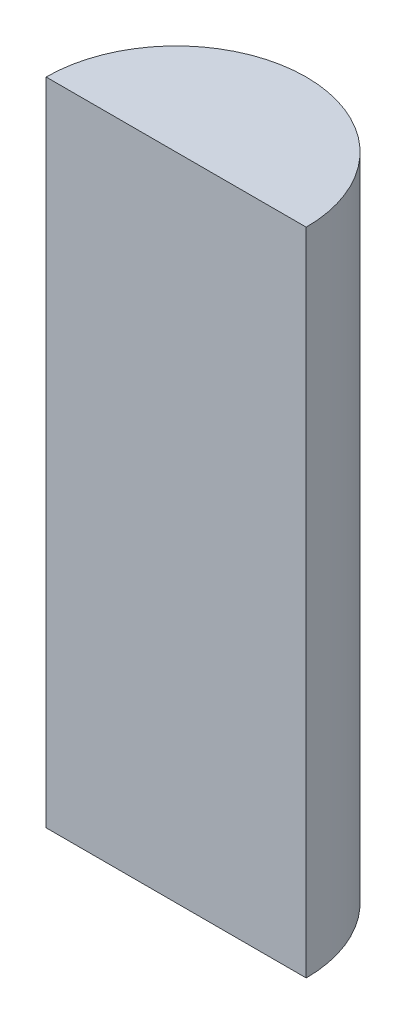
ISO-10303-21;
HEADER;
FILE_DESCRIPTION(('STEP AP214'),'2;1');
FILE_NAME('part.step','',(''),(''),'','','');
FILE_SCHEMA(('AUTOMOTIVE_DESIGN { 1 0 10303 214 1 1 1 1 }'));
ENDSEC;
DATA;
#1=APPLICATION_CONTEXT('core data for automotive mechanical design processes');
#2=APPLICATION_PROTOCOL_DEFINITION('international standard','automotive_design',2000,#1);
#3=PRODUCT_CONTEXT('',#1,'mechanical');
#4=PRODUCT('Part','Part','',(#3));
#5=PRODUCT_RELATED_PRODUCT_CATEGORY('part','',(#4));
#6=PRODUCT_DEFINITION_FORMATION('','',#4);
#7=PRODUCT_DEFINITION_CONTEXT('part definition',#1,'design');
#8=PRODUCT_DEFINITION('design','',#6,#7);
#9=PRODUCT_DEFINITION_SHAPE('','',#8);
#10=(LENGTH_UNIT() NAMED_UNIT(*) SI_UNIT(.MILLI.,.METRE.));
#11=(NAMED_UNIT(*) PLANE_ANGLE_UNIT() SI_UNIT($,.RADIAN.));
#12=(NAMED_UNIT(*) SI_UNIT($,.STERADIAN.) SOLID_ANGLE_UNIT());
#13=UNCERTAINTY_MEASURE_WITH_UNIT(LENGTH_MEASURE(1.E-05),#10,'distance_accuracy_value','');
#14=(GEOMETRIC_REPRESENTATION_CONTEXT(3) GLOBAL_UNCERTAINTY_ASSIGNED_CONTEXT((#13)) GLOBAL_UNIT_ASSIGNED_CONTEXT((#10,
#11,#12)) REPRESENTATION_CONTEXT('',''));
#15=CARTESIAN_POINT('',(0.,0.,0.));
#16=DIRECTION('',(0.,0.,1.));
#17=DIRECTION('',(1.,0.,0.));
#18=AXIS2_PLACEMENT_3D('',#15,#16,#17);
#19=CARTESIAN_POINT('',(0.,25.,0.));
#20=DIRECTION('',(0.,1.,0.));
#21=DIRECTION('',(0.,0.,1.));
#22=AXIS2_PLACEMENT_3D('',#19,#20,#21);
#23=CYLINDRICAL_SURFACE('',#22,10.);
#24=CARTESIAN_POINT('',(0.,-25.,0.));
#25=DIRECTION('',(0.,1.,0.));
#26=DIRECTION('',(0.,0.,1.));
#27=AXIS2_PLACEMENT_3D('',#24,#25,#26);
#28=CIRCLE('',#27,10.);
#29=CARTESIAN_POINT('',(9.99999999999999,-25.,0.));
#30=VERTEX_POINT('',#29);
#31=CARTESIAN_POINT('',(-10.,-25.,0.));
#32=VERTEX_POINT('',#31);
#33=EDGE_CURVE('E11',#30,#32,#28,.T.);
#34=ORIENTED_EDGE('',*,*,#33,.T.);
#35=DIRECTION('',(0.,1.,0.));
#36=VECTOR('',#35,1.);
#37=CARTESIAN_POINT('',(-10.,25.,0.));
#38=LINE('',#37,#36);
#39=CARTESIAN_POINT('',(-10.,25.,0.));
#40=VERTEX_POINT('',#39);
#41=EDGE_CURVE('E66',#40,#32,#38,.F.);
#42=ORIENTED_EDGE('',*,*,#41,.F.);
#43=CARTESIAN_POINT('',(0.,25.,0.));
#44=DIRECTION('',(0.,1.,0.));
#45=DIRECTION('',(0.,0.,1.));
#46=AXIS2_PLACEMENT_3D('',#43,#44,#45);
#47=CIRCLE('',#46,10.);
#48=CARTESIAN_POINT('',(9.99999999999999,25.,0.));
#49=VERTEX_POINT('',#48);
#50=EDGE_CURVE('E43',#49,#40,#47,.T.);
#51=ORIENTED_EDGE('',*,*,#50,.F.);
#52=DIRECTION('',(0.,1.,0.));
#53=VECTOR('',#52,1.);
#54=CARTESIAN_POINT('',(9.99999999999999,25.,0.));
#55=LINE('',#54,#53);
#56=EDGE_CURVE('E64',#49,#30,#55,.F.);
#57=ORIENTED_EDGE('',*,*,#56,.T.);
#58=EDGE_LOOP('',(#34,#42,#51,#57));
#59=FACE_BOUND('',#58,.T.);
#60=ADVANCED_FACE('F35',(#59),#23,.T.);
#61=CARTESIAN_POINT('',(0.,-25.,0.));
#62=DIRECTION('',(0.,1.,0.));
#63=DIRECTION('',(0.,0.,1.));
#64=AXIS2_PLACEMENT_3D('',#61,#62,#63);
#65=PLANE('',#64);
#66=DIRECTION('',(1.,0.,0.));
#67=VECTOR('',#66,1.);
#68=CARTESIAN_POINT('',(0.,-25.,0.));
#69=LINE('',#68,#67);
#70=EDGE_CURVE('E60',#32,#30,#69,.T.);
#71=ORIENTED_EDGE('',*,*,#70,.F.);
#72=ORIENTED_EDGE('',*,*,#33,.F.);
#73=EDGE_LOOP('',(#71,#72));
#74=FACE_BOUND('',#73,.T.);
#75=ADVANCED_FACE('F37',(#74),#65,.F.);
#76=CARTESIAN_POINT('',(9.99999999999999,25.,0.));
#77=DIRECTION('',(0.,-1.,0.));
#78=DIRECTION('',(0.,0.,-1.));
#79=AXIS2_PLACEMENT_3D('',#76,#77,#78);
#80=PLANE('',#79);
#81=DIRECTION('',(-1.,0.,0.));
#82=VECTOR('',#81,1.);
#83=CARTESIAN_POINT('',(9.99999999999999,25.,0.));
#84=LINE('',#83,#82);
#85=EDGE_CURVE('E63',#49,#40,#84,.T.);
#86=ORIENTED_EDGE('',*,*,#85,.F.);
#87=ORIENTED_EDGE('',*,*,#50,.T.);
#88=EDGE_LOOP('',(#86,#87));
#89=FACE_BOUND('',#88,.T.);
#90=ADVANCED_FACE('F73',(#89),#80,.F.);
#91=CARTESIAN_POINT('',(0.,0.,0.));
#92=DIRECTION('',(0.,0.,-1.));
#93=DIRECTION('',(-1.,0.,0.));
#94=AXIS2_PLACEMENT_3D('',#91,#92,#93);
#95=PLANE('',#94);
#96=ORIENTED_EDGE('',*,*,#56,.F.);
#97=ORIENTED_EDGE('',*,*,#85,.T.);
#98=ORIENTED_EDGE('',*,*,#41,.T.);
#99=ORIENTED_EDGE('',*,*,#70,.T.);
#100=EDGE_LOOP('',(#96,#97,#98,#99));
#101=FACE_BOUND('',#100,.T.);
#102=ADVANCED_FACE('F67',(#101),#95,.F.);
#103=CLOSED_SHELL('',(#60,#75,#90,#102));
#104=MANIFOLD_SOLID_BREP('B2',#103);
#105=ADVANCED_BREP_SHAPE_REPRESENTATION('',(#18,#104),#14);
#106=SHAPE_DEFINITION_REPRESENTATION(#9,#105);
ENDSEC;
END-ISO-10303-21;
